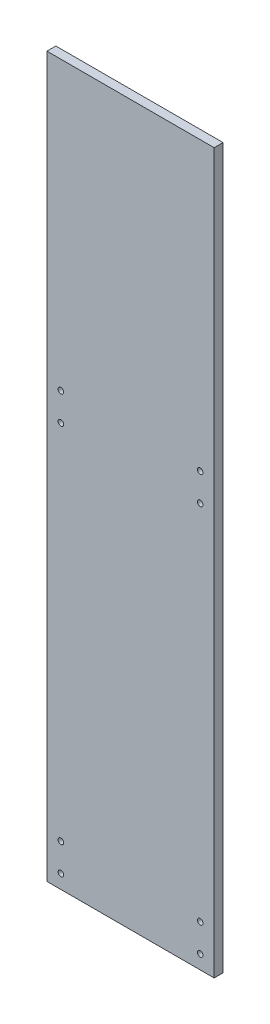
ISO-10303-21;
HEADER;
FILE_DESCRIPTION(('STEP AP214'),'2;1');
FILE_NAME('part.step','',(''),(''),'','','');
FILE_SCHEMA(('AUTOMOTIVE_DESIGN { 1 0 10303 214 1 1 1 1 }'));
ENDSEC;
DATA;
#1=APPLICATION_CONTEXT('core data for automotive mechanical design processes');
#2=APPLICATION_PROTOCOL_DEFINITION('international standard','automotive_design',2000,#1);
#3=PRODUCT_CONTEXT('',#1,'mechanical');
#4=PRODUCT('Part','Part','',(#3));
#5=PRODUCT_RELATED_PRODUCT_CATEGORY('part','',(#4));
#6=PRODUCT_DEFINITION_FORMATION('','',#4);
#7=PRODUCT_DEFINITION_CONTEXT('part definition',#1,'design');
#8=PRODUCT_DEFINITION('design','',#6,#7);
#9=PRODUCT_DEFINITION_SHAPE('','',#8);
#10=(LENGTH_UNIT() NAMED_UNIT(*) SI_UNIT(.MILLI.,.METRE.));
#11=(NAMED_UNIT(*) PLANE_ANGLE_UNIT() SI_UNIT($,.RADIAN.));
#12=(NAMED_UNIT(*) SI_UNIT($,.STERADIAN.) SOLID_ANGLE_UNIT());
#13=UNCERTAINTY_MEASURE_WITH_UNIT(LENGTH_MEASURE(1.E-05),#10,'distance_accuracy_value','');
#14=(GEOMETRIC_REPRESENTATION_CONTEXT(3) GLOBAL_UNCERTAINTY_ASSIGNED_CONTEXT((#13)) GLOBAL_UNIT_ASSIGNED_CONTEXT((#10,
#11,#12)) REPRESENTATION_CONTEXT('',''));
#15=CARTESIAN_POINT('',(0.,0.,0.));
#16=DIRECTION('',(0.,0.,1.));
#17=DIRECTION('',(1.,0.,0.));
#18=AXIS2_PLACEMENT_3D('',#15,#16,#17);
#19=CARTESIAN_POINT('',(0.,0.,1.6));
#20=DIRECTION('',(0.,0.,-1.));
#21=DIRECTION('',(-1.,0.,0.));
#22=AXIS2_PLACEMENT_3D('',#19,#20,#21);
#23=PLANE('',#22);
#24=DIRECTION('',(0.,1.,0.));
#25=VECTOR('',#24,1.);
#26=CARTESIAN_POINT('',(189.879127706682,128.,1.6));
#27=LINE('',#26,#25);
#28=CARTESIAN_POINT('',(189.879127706682,-1.0000000679983,1.6));
#29=VERTEX_POINT('',#28);
#30=CARTESIAN_POINT('',(189.879127706682,128.,1.6));
#31=VERTEX_POINT('',#30);
#32=EDGE_CURVE('E86',#29,#31,#27,.T.);
#33=ORIENTED_EDGE('',*,*,#32,.T.);
#34=DIRECTION('',(-1.,0.,0.));
#35=VECTOR('',#34,1.);
#36=CARTESIAN_POINT('',(159.879127706682,128.,1.6));
#37=LINE('',#36,#35);
#38=CARTESIAN_POINT('',(159.879127706682,128.,1.6));
#39=VERTEX_POINT('',#38);
#40=EDGE_CURVE('E81',#31,#39,#37,.T.);
#41=ORIENTED_EDGE('',*,*,#40,.T.);
#42=DIRECTION('',(0.,-1.,0.));
#43=VECTOR('',#42,1.);
#44=CARTESIAN_POINT('',(159.879127706682,-1.0000000679983,1.6));
#45=LINE('',#44,#43);
#46=CARTESIAN_POINT('',(159.879127706682,-1.0000000679983,1.6));
#47=VERTEX_POINT('',#46);
#48=EDGE_CURVE('E84',#39,#47,#45,.T.);
#49=ORIENTED_EDGE('',*,*,#48,.T.);
#50=DIRECTION('',(1.,0.,0.));
#51=VECTOR('',#50,1.);
#52=CARTESIAN_POINT('',(189.879127706682,-1.0000000679983,1.6));
#53=LINE('',#52,#51);
#54=EDGE_CURVE('E51',#47,#29,#53,.T.);
#55=ORIENTED_EDGE('',*,*,#54,.T.);
#56=EDGE_LOOP('',(#33,#41,#49,#55));
#57=FACE_BOUND('',#56,.T.);
#58=CARTESIAN_POINT('',(162.379127706682,6.4999999320017,1.6));
#59=DIRECTION('',(0.,0.,1.));
#60=DIRECTION('',(1.,0.,0.));
#61=AXIS2_PLACEMENT_3D('',#58,#59,#60);
#62=CIRCLE('',#61,0.5);
#63=CARTESIAN_POINT('',(162.879127706682,6.4999999320017,1.6));
#64=VERTEX_POINT('',#63);
#65=EDGE_CURVE('E101',#64,#64,#62,.T.);
#66=ORIENTED_EDGE('',*,*,#65,.F.);
#67=EDGE_LOOP('',(#66));
#68=FACE_BOUND('',#67,.T.);
#69=CARTESIAN_POINT('',(162.379127706682,71.4999999320017,1.6));
#70=DIRECTION('',(0.,0.,1.));
#71=DIRECTION('',(1.,0.,0.));
#72=AXIS2_PLACEMENT_3D('',#69,#70,#71);
#73=CIRCLE('',#72,0.5);
#74=CARTESIAN_POINT('',(162.879127706682,71.4999999320017,1.6));
#75=VERTEX_POINT('',#74);
#76=EDGE_CURVE('E116',#75,#75,#73,.T.);
#77=ORIENTED_EDGE('',*,*,#76,.F.);
#78=EDGE_LOOP('',(#77));
#79=FACE_BOUND('',#78,.T.);
#80=CARTESIAN_POINT('',(187.379127706682,6.4999999320017,1.6));
#81=DIRECTION('',(0.,0.,1.));
#82=DIRECTION('',(1.,0.,0.));
#83=AXIS2_PLACEMENT_3D('',#80,#81,#82);
#84=CIRCLE('',#83,0.5);
#85=CARTESIAN_POINT('',(187.879127706682,6.4999999320017,1.6));
#86=VERTEX_POINT('',#85);
#87=EDGE_CURVE('E122',#86,#86,#84,.T.);
#88=ORIENTED_EDGE('',*,*,#87,.F.);
#89=EDGE_LOOP('',(#88));
#90=FACE_BOUND('',#89,.T.);
#91=CARTESIAN_POINT('',(187.379127706682,71.4999999320017,1.6));
#92=DIRECTION('',(0.,0.,1.));
#93=DIRECTION('',(1.,0.,0.));
#94=AXIS2_PLACEMENT_3D('',#91,#92,#93);
#95=CIRCLE('',#94,0.5);
#96=CARTESIAN_POINT('',(187.879127706682,71.4999999320017,1.6));
#97=VERTEX_POINT('',#96);
#98=EDGE_CURVE('E128',#97,#97,#95,.T.);
#99=ORIENTED_EDGE('',*,*,#98,.F.);
#100=EDGE_LOOP('',(#99));
#101=FACE_BOUND('',#100,.T.);
#102=CARTESIAN_POINT('',(162.379127706682,76.4999999320017,1.6));
#103=DIRECTION('',(0.,0.,1.));
#104=DIRECTION('',(1.,0.,0.));
#105=AXIS2_PLACEMENT_3D('',#102,#103,#104);
#106=CIRCLE('',#105,0.5);
#107=CARTESIAN_POINT('',(162.879127706682,76.4999999320017,1.6));
#108=VERTEX_POINT('',#107);
#109=EDGE_CURVE('E134',#108,#108,#106,.T.);
#110=ORIENTED_EDGE('',*,*,#109,.F.);
#111=EDGE_LOOP('',(#110));
#112=FACE_BOUND('',#111,.T.);
#113=CARTESIAN_POINT('',(187.379127706682,76.4999999320017,1.6));
#114=DIRECTION('',(0.,0.,1.));
#115=DIRECTION('',(1.,0.,0.));
#116=AXIS2_PLACEMENT_3D('',#113,#114,#115);
#117=CIRCLE('',#116,0.5);
#118=CARTESIAN_POINT('',(187.879127706682,76.4999999320017,1.6));
#119=VERTEX_POINT('',#118);
#120=EDGE_CURVE('E140',#119,#119,#117,.T.);
#121=ORIENTED_EDGE('',*,*,#120,.F.);
#122=EDGE_LOOP('',(#121));
#123=FACE_BOUND('',#122,.T.);
#124=CARTESIAN_POINT('',(162.379127706682,1.4999999320017,1.6));
#125=DIRECTION('',(0.,0.,1.));
#126=DIRECTION('',(1.,0.,0.));
#127=AXIS2_PLACEMENT_3D('',#124,#125,#126);
#128=CIRCLE('',#127,0.5);
#129=CARTESIAN_POINT('',(162.879127706682,1.4999999320017,1.6));
#130=VERTEX_POINT('',#129);
#131=EDGE_CURVE('E146',#130,#130,#128,.T.);
#132=ORIENTED_EDGE('',*,*,#131,.F.);
#133=EDGE_LOOP('',(#132));
#134=FACE_BOUND('',#133,.T.);
#135=CARTESIAN_POINT('',(187.379127706682,1.4999999320017,1.6));
#136=DIRECTION('',(0.,0.,1.));
#137=DIRECTION('',(1.,0.,0.));
#138=AXIS2_PLACEMENT_3D('',#135,#136,#137);
#139=CIRCLE('',#138,0.5);
#140=CARTESIAN_POINT('',(187.879127706682,1.4999999320017,1.6));
#141=VERTEX_POINT('',#140);
#142=EDGE_CURVE('E152',#141,#141,#139,.T.);
#143=ORIENTED_EDGE('',*,*,#142,.F.);
#144=EDGE_LOOP('',(#143));
#145=FACE_BOUND('',#144,.T.);
#146=ADVANCED_FACE('F34',(#57,#68,#79,#90,#101,#112,#123,#134,#145),#23,.F.);
#147=CARTESIAN_POINT('',(0.,0.,0.));
#148=DIRECTION('',(0.,0.,-1.));
#149=DIRECTION('',(-1.,0.,0.));
#150=AXIS2_PLACEMENT_3D('',#147,#148,#149);
#151=PLANE('',#150);
#152=CARTESIAN_POINT('',(162.379127706682,1.4999999320017,0.));
#153=DIRECTION('',(0.,0.,1.));
#154=DIRECTION('',(1.,0.,0.));
#155=AXIS2_PLACEMENT_3D('',#152,#153,#154);
#156=CIRCLE('',#155,0.5);
#157=CARTESIAN_POINT('',(162.879127706682,1.4999999320017,0.));
#158=VERTEX_POINT('',#157);
#159=EDGE_CURVE('E149',#158,#158,#156,.T.);
#160=ORIENTED_EDGE('',*,*,#159,.T.);
#161=EDGE_LOOP('',(#160));
#162=FACE_BOUND('',#161,.T.);
#163=CARTESIAN_POINT('',(162.379127706682,76.4999999320017,0.));
#164=DIRECTION('',(0.,0.,1.));
#165=DIRECTION('',(1.,0.,0.));
#166=AXIS2_PLACEMENT_3D('',#163,#164,#165);
#167=CIRCLE('',#166,0.5);
#168=CARTESIAN_POINT('',(162.879127706682,76.4999999320017,0.));
#169=VERTEX_POINT('',#168);
#170=EDGE_CURVE('E137',#169,#169,#167,.T.);
#171=ORIENTED_EDGE('',*,*,#170,.T.);
#172=EDGE_LOOP('',(#171));
#173=FACE_BOUND('',#172,.T.);
#174=CARTESIAN_POINT('',(187.379127706682,6.4999999320017,0.));
#175=DIRECTION('',(0.,0.,1.));
#176=DIRECTION('',(1.,0.,0.));
#177=AXIS2_PLACEMENT_3D('',#174,#175,#176);
#178=CIRCLE('',#177,0.5);
#179=CARTESIAN_POINT('',(187.879127706682,6.4999999320017,0.));
#180=VERTEX_POINT('',#179);
#181=EDGE_CURVE('E125',#180,#180,#178,.T.);
#182=ORIENTED_EDGE('',*,*,#181,.T.);
#183=EDGE_LOOP('',(#182));
#184=FACE_BOUND('',#183,.T.);
#185=CARTESIAN_POINT('',(162.379127706682,6.4999999320017,0.));
#186=DIRECTION('',(0.,0.,1.));
#187=DIRECTION('',(1.,0.,0.));
#188=AXIS2_PLACEMENT_3D('',#185,#186,#187);
#189=CIRCLE('',#188,0.5);
#190=CARTESIAN_POINT('',(162.879127706682,6.4999999320017,0.));
#191=VERTEX_POINT('',#190);
#192=EDGE_CURVE('E113',#191,#191,#189,.T.);
#193=ORIENTED_EDGE('',*,*,#192,.T.);
#194=EDGE_LOOP('',(#193));
#195=FACE_BOUND('',#194,.T.);
#196=DIRECTION('',(0.,1.,0.));
#197=VECTOR('',#196,1.);
#198=CARTESIAN_POINT('',(189.879127706682,128.,0.));
#199=LINE('',#198,#197);
#200=CARTESIAN_POINT('',(189.879127706682,-1.0000000679983,0.));
#201=VERTEX_POINT('',#200);
#202=CARTESIAN_POINT('',(189.879127706682,128.,0.));
#203=VERTEX_POINT('',#202);
#204=EDGE_CURVE('E98',#201,#203,#199,.T.);
#205=ORIENTED_EDGE('',*,*,#204,.F.);
#206=DIRECTION('',(1.,0.,0.));
#207=VECTOR('',#206,1.);
#208=CARTESIAN_POINT('',(189.879127706682,-1.0000000679983,0.));
#209=LINE('',#208,#207);
#210=CARTESIAN_POINT('',(159.879127706682,-1.0000000679983,0.));
#211=VERTEX_POINT('',#210);
#212=EDGE_CURVE('E74',#211,#201,#209,.T.);
#213=ORIENTED_EDGE('',*,*,#212,.F.);
#214=DIRECTION('',(0.,-1.,0.));
#215=VECTOR('',#214,1.);
#216=CARTESIAN_POINT('',(159.879127706682,-1.0000000679983,0.));
#217=LINE('',#216,#215);
#218=CARTESIAN_POINT('',(159.879127706682,128.,0.));
#219=VERTEX_POINT('',#218);
#220=EDGE_CURVE('E68',#219,#211,#217,.T.);
#221=ORIENTED_EDGE('',*,*,#220,.F.);
#222=DIRECTION('',(-1.,0.,0.));
#223=VECTOR('',#222,1.);
#224=CARTESIAN_POINT('',(159.879127706682,128.,0.));
#225=LINE('',#224,#223);
#226=EDGE_CURVE('E90',#203,#219,#225,.T.);
#227=ORIENTED_EDGE('',*,*,#226,.F.);
#228=EDGE_LOOP('',(#205,#213,#221,#227));
#229=FACE_BOUND('',#228,.T.);
#230=CARTESIAN_POINT('',(162.379127706682,71.4999999320017,0.));
#231=DIRECTION('',(0.,0.,1.));
#232=DIRECTION('',(1.,0.,0.));
#233=AXIS2_PLACEMENT_3D('',#230,#231,#232);
#234=CIRCLE('',#233,0.5);
#235=CARTESIAN_POINT('',(162.879127706682,71.4999999320017,0.));
#236=VERTEX_POINT('',#235);
#237=EDGE_CURVE('E119',#236,#236,#234,.T.);
#238=ORIENTED_EDGE('',*,*,#237,.T.);
#239=EDGE_LOOP('',(#238));
#240=FACE_BOUND('',#239,.T.);
#241=CARTESIAN_POINT('',(187.379127706682,71.4999999320017,0.));
#242=DIRECTION('',(0.,0.,1.));
#243=DIRECTION('',(1.,0.,0.));
#244=AXIS2_PLACEMENT_3D('',#241,#242,#243);
#245=CIRCLE('',#244,0.5);
#246=CARTESIAN_POINT('',(187.879127706682,71.4999999320017,0.));
#247=VERTEX_POINT('',#246);
#248=EDGE_CURVE('E131',#247,#247,#245,.T.);
#249=ORIENTED_EDGE('',*,*,#248,.T.);
#250=EDGE_LOOP('',(#249));
#251=FACE_BOUND('',#250,.T.);
#252=CARTESIAN_POINT('',(187.379127706682,76.4999999320017,0.));
#253=DIRECTION('',(0.,0.,1.));
#254=DIRECTION('',(1.,0.,0.));
#255=AXIS2_PLACEMENT_3D('',#252,#253,#254);
#256=CIRCLE('',#255,0.5);
#257=CARTESIAN_POINT('',(187.879127706682,76.4999999320017,0.));
#258=VERTEX_POINT('',#257);
#259=EDGE_CURVE('E143',#258,#258,#256,.T.);
#260=ORIENTED_EDGE('',*,*,#259,.T.);
#261=EDGE_LOOP('',(#260));
#262=FACE_BOUND('',#261,.T.);
#263=CARTESIAN_POINT('',(187.379127706682,1.4999999320017,0.));
#264=DIRECTION('',(0.,0.,1.));
#265=DIRECTION('',(1.,0.,0.));
#266=AXIS2_PLACEMENT_3D('',#263,#264,#265);
#267=CIRCLE('',#266,0.5);
#268=CARTESIAN_POINT('',(187.879127706682,1.4999999320017,0.));
#269=VERTEX_POINT('',#268);
#270=EDGE_CURVE('E155',#269,#269,#267,.T.);
#271=ORIENTED_EDGE('',*,*,#270,.T.);
#272=EDGE_LOOP('',(#271));
#273=FACE_BOUND('',#272,.T.);
#274=ADVANCED_FACE('F109',(#162,#173,#184,#195,#229,#240,#251,#262,#273),#151,.T.);
#275=CARTESIAN_POINT('',(189.879127706682,128.,1.6));
#276=DIRECTION('',(-1.,0.,0.));
#277=DIRECTION('',(0.,-1.,0.));
#278=AXIS2_PLACEMENT_3D('',#275,#276,#277);
#279=PLANE('',#278);
#280=ORIENTED_EDGE('',*,*,#204,.T.);
#281=DIRECTION('',(0.,0.,-1.));
#282=VECTOR('',#281,1.);
#283=CARTESIAN_POINT('',(189.879127706682,128.,1.6));
#284=LINE('',#283,#282);
#285=EDGE_CURVE('E11',#31,#203,#284,.T.);
#286=ORIENTED_EDGE('',*,*,#285,.F.);
#287=ORIENTED_EDGE('',*,*,#32,.F.);
#288=DIRECTION('',(0.,0.,-1.));
#289=VECTOR('',#288,1.);
#290=CARTESIAN_POINT('',(189.879127706682,-1.0000000679983,1.6));
#291=LINE('',#290,#289);
#292=EDGE_CURVE('E94',#29,#201,#291,.T.);
#293=ORIENTED_EDGE('',*,*,#292,.T.);
#294=EDGE_LOOP('',(#280,#286,#287,#293));
#295=FACE_BOUND('',#294,.T.);
#296=ADVANCED_FACE('F36',(#295),#279,.F.);
#297=CARTESIAN_POINT('',(159.879127706682,128.,1.6));
#298=DIRECTION('',(0.,-1.,0.));
#299=DIRECTION('',(0.,0.,-1.));
#300=AXIS2_PLACEMENT_3D('',#297,#298,#299);
#301=PLANE('',#300);
#302=ORIENTED_EDGE('',*,*,#226,.T.);
#303=DIRECTION('',(0.,0.,-1.));
#304=VECTOR('',#303,1.);
#305=CARTESIAN_POINT('',(159.879127706682,128.,1.6));
#306=LINE('',#305,#304);
#307=EDGE_CURVE('E43',#39,#219,#306,.T.);
#308=ORIENTED_EDGE('',*,*,#307,.F.);
#309=ORIENTED_EDGE('',*,*,#40,.F.);
#310=ORIENTED_EDGE('',*,*,#285,.T.);
#311=EDGE_LOOP('',(#302,#308,#309,#310));
#312=FACE_BOUND('',#311,.T.);
#313=ADVANCED_FACE('F89',(#312),#301,.F.);
#314=CARTESIAN_POINT('',(159.879127706682,-1.0000000679983,1.6));
#315=DIRECTION('',(1.,0.,0.));
#316=DIRECTION('',(0.,1.,0.));
#317=AXIS2_PLACEMENT_3D('',#314,#315,#316);
#318=PLANE('',#317);
#319=ORIENTED_EDGE('',*,*,#220,.T.);
#320=DIRECTION('',(0.,0.,-1.));
#321=VECTOR('',#320,1.);
#322=CARTESIAN_POINT('',(159.879127706682,-1.0000000679983,1.6));
#323=LINE('',#322,#321);
#324=EDGE_CURVE('E91',#47,#211,#323,.T.);
#325=ORIENTED_EDGE('',*,*,#324,.F.);
#326=ORIENTED_EDGE('',*,*,#48,.F.);
#327=ORIENTED_EDGE('',*,*,#307,.T.);
#328=EDGE_LOOP('',(#319,#325,#326,#327));
#329=FACE_BOUND('',#328,.T.);
#330=ADVANCED_FACE('F92',(#329),#318,.F.);
#331=CARTESIAN_POINT('',(189.879127706682,-1.0000000679983,1.6));
#332=DIRECTION('',(0.,1.,0.));
#333=DIRECTION('',(-1.,0.,0.));
#334=AXIS2_PLACEMENT_3D('',#331,#332,#333);
#335=PLANE('',#334);
#336=ORIENTED_EDGE('',*,*,#212,.T.);
#337=ORIENTED_EDGE('',*,*,#292,.F.);
#338=ORIENTED_EDGE('',*,*,#54,.F.);
#339=ORIENTED_EDGE('',*,*,#324,.T.);
#340=EDGE_LOOP('',(#336,#337,#338,#339));
#341=FACE_BOUND('',#340,.T.);
#342=ADVANCED_FACE('F106',(#341),#335,.F.);
#343=CARTESIAN_POINT('',(162.379127706682,6.4999999320017,1.6));
#344=DIRECTION('',(0.,0.,-1.));
#345=DIRECTION('',(-1.,0.,0.));
#346=AXIS2_PLACEMENT_3D('',#343,#344,#345);
#347=CYLINDRICAL_SURFACE('',#346,0.5);
#348=ORIENTED_EDGE('',*,*,#65,.T.);
#349=EDGE_LOOP('',(#348));
#350=FACE_BOUND('',#349,.T.);
#351=ORIENTED_EDGE('',*,*,#192,.F.);
#352=EDGE_LOOP('',(#351));
#353=FACE_BOUND('',#352,.T.);
#354=ADVANCED_FACE('F172',(#350,#353),#347,.F.);
#355=CARTESIAN_POINT('',(162.379127706682,71.4999999320017,1.6));
#356=DIRECTION('',(0.,0.,-1.));
#357=DIRECTION('',(-1.,0.,0.));
#358=AXIS2_PLACEMENT_3D('',#355,#356,#357);
#359=CYLINDRICAL_SURFACE('',#358,0.5);
#360=ORIENTED_EDGE('',*,*,#76,.T.);
#361=EDGE_LOOP('',(#360));
#362=FACE_BOUND('',#361,.T.);
#363=ORIENTED_EDGE('',*,*,#237,.F.);
#364=EDGE_LOOP('',(#363));
#365=FACE_BOUND('',#364,.T.);
#366=ADVANCED_FACE('F218',(#362,#365),#359,.F.);
#367=CARTESIAN_POINT('',(187.379127706682,6.4999999320017,1.6));
#368=DIRECTION('',(0.,0.,-1.));
#369=DIRECTION('',(-1.,0.,0.));
#370=AXIS2_PLACEMENT_3D('',#367,#368,#369);
#371=CYLINDRICAL_SURFACE('',#370,0.5);
#372=ORIENTED_EDGE('',*,*,#87,.T.);
#373=EDGE_LOOP('',(#372));
#374=FACE_BOUND('',#373,.T.);
#375=ORIENTED_EDGE('',*,*,#181,.F.);
#376=EDGE_LOOP('',(#375));
#377=FACE_BOUND('',#376,.T.);
#378=ADVANCED_FACE('F226',(#374,#377),#371,.F.);
#379=CARTESIAN_POINT('',(187.379127706682,71.4999999320017,1.6));
#380=DIRECTION('',(0.,0.,-1.));
#381=DIRECTION('',(-1.,0.,0.));
#382=AXIS2_PLACEMENT_3D('',#379,#380,#381);
#383=CYLINDRICAL_SURFACE('',#382,0.5);
#384=ORIENTED_EDGE('',*,*,#98,.T.);
#385=EDGE_LOOP('',(#384));
#386=FACE_BOUND('',#385,.T.);
#387=ORIENTED_EDGE('',*,*,#248,.F.);
#388=EDGE_LOOP('',(#387));
#389=FACE_BOUND('',#388,.T.);
#390=ADVANCED_FACE('F234',(#386,#389),#383,.F.);
#391=CARTESIAN_POINT('',(162.379127706682,76.4999999320017,1.6));
#392=DIRECTION('',(0.,0.,-1.));
#393=DIRECTION('',(-1.,0.,0.));
#394=AXIS2_PLACEMENT_3D('',#391,#392,#393);
#395=CYLINDRICAL_SURFACE('',#394,0.5);
#396=ORIENTED_EDGE('',*,*,#109,.T.);
#397=EDGE_LOOP('',(#396));
#398=FACE_BOUND('',#397,.T.);
#399=ORIENTED_EDGE('',*,*,#170,.F.);
#400=EDGE_LOOP('',(#399));
#401=FACE_BOUND('',#400,.T.);
#402=ADVANCED_FACE('F243',(#398,#401),#395,.F.);
#403=CARTESIAN_POINT('',(187.379127706682,76.4999999320017,1.6));
#404=DIRECTION('',(0.,0.,-1.));
#405=DIRECTION('',(-1.,0.,0.));
#406=AXIS2_PLACEMENT_3D('',#403,#404,#405);
#407=CYLINDRICAL_SURFACE('',#406,0.5);
#408=ORIENTED_EDGE('',*,*,#120,.T.);
#409=EDGE_LOOP('',(#408));
#410=FACE_BOUND('',#409,.T.);
#411=ORIENTED_EDGE('',*,*,#259,.F.);
#412=EDGE_LOOP('',(#411));
#413=FACE_BOUND('',#412,.T.);
#414=ADVANCED_FACE('F252',(#410,#413),#407,.F.);
#415=CARTESIAN_POINT('',(162.379127706682,1.4999999320017,1.6));
#416=DIRECTION('',(0.,0.,-1.));
#417=DIRECTION('',(-1.,0.,0.));
#418=AXIS2_PLACEMENT_3D('',#415,#416,#417);
#419=CYLINDRICAL_SURFACE('',#418,0.5);
#420=ORIENTED_EDGE('',*,*,#131,.T.);
#421=EDGE_LOOP('',(#420));
#422=FACE_BOUND('',#421,.T.);
#423=ORIENTED_EDGE('',*,*,#159,.F.);
#424=EDGE_LOOP('',(#423));
#425=FACE_BOUND('',#424,.T.);
#426=ADVANCED_FACE('F261',(#422,#425),#419,.F.);
#427=CARTESIAN_POINT('',(187.379127706682,1.4999999320017,1.6));
#428=DIRECTION('',(0.,0.,-1.));
#429=DIRECTION('',(-1.,0.,0.));
#430=AXIS2_PLACEMENT_3D('',#427,#428,#429);
#431=CYLINDRICAL_SURFACE('',#430,0.5);
#432=ORIENTED_EDGE('',*,*,#142,.T.);
#433=EDGE_LOOP('',(#432));
#434=FACE_BOUND('',#433,.T.);
#435=ORIENTED_EDGE('',*,*,#270,.F.);
#436=EDGE_LOOP('',(#435));
#437=FACE_BOUND('',#436,.T.);
#438=ADVANCED_FACE('F161',(#434,#437),#431,.F.);
#439=CLOSED_SHELL('',(#146,#274,#296,#313,#330,#342,#354,#366,#378,#390,#402,#414,#426,#438));
#440=MANIFOLD_SOLID_BREP('B2',#439);
#441=ADVANCED_BREP_SHAPE_REPRESENTATION('',(#18,#440),#14);
#442=SHAPE_DEFINITION_REPRESENTATION(#9,#441);
ENDSEC;
END-ISO-10303-21;
